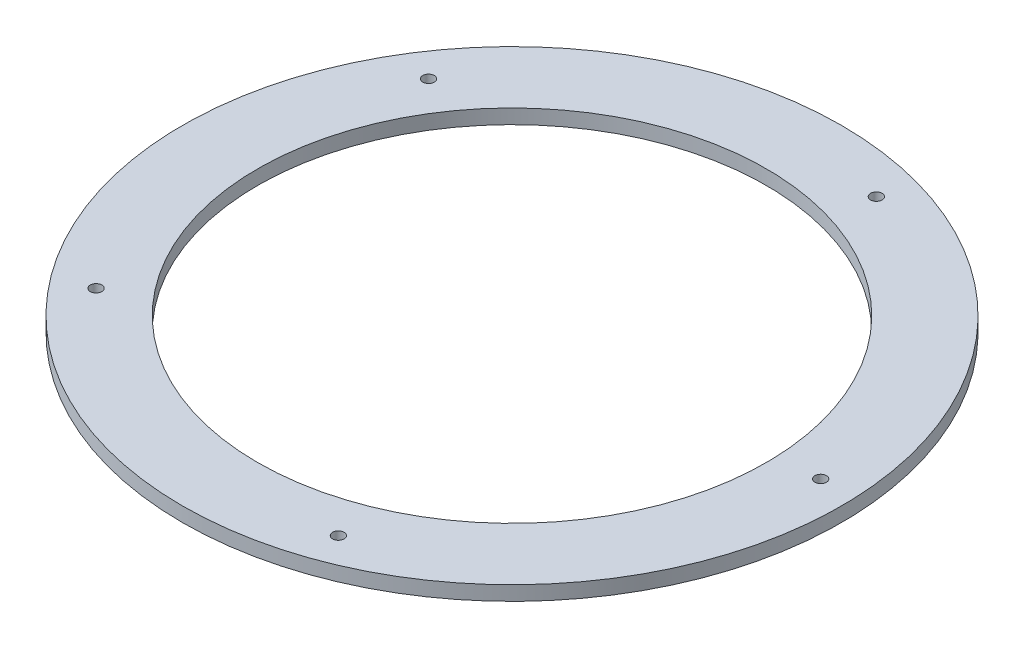
ISO-10303-21;
HEADER;
FILE_DESCRIPTION(('STEP AP214'),'2;1');
FILE_NAME('part.step','',(''),(''),'','','');
FILE_SCHEMA(('AUTOMOTIVE_DESIGN { 1 0 10303 214 1 1 1 1 }'));
ENDSEC;
DATA;
#1=APPLICATION_CONTEXT('core data for automotive mechanical design processes');
#2=APPLICATION_PROTOCOL_DEFINITION('international standard','automotive_design',2000,#1);
#3=PRODUCT_CONTEXT('',#1,'mechanical');
#4=PRODUCT('Part','Part','',(#3));
#5=PRODUCT_RELATED_PRODUCT_CATEGORY('part','',(#4));
#6=PRODUCT_DEFINITION_FORMATION('','',#4);
#7=PRODUCT_DEFINITION_CONTEXT('part definition',#1,'design');
#8=PRODUCT_DEFINITION('design','',#6,#7);
#9=PRODUCT_DEFINITION_SHAPE('','',#8);
#10=(LENGTH_UNIT() NAMED_UNIT(*) SI_UNIT(.MILLI.,.METRE.));
#11=(NAMED_UNIT(*) PLANE_ANGLE_UNIT() SI_UNIT($,.RADIAN.));
#12=(NAMED_UNIT(*) SI_UNIT($,.STERADIAN.) SOLID_ANGLE_UNIT());
#13=UNCERTAINTY_MEASURE_WITH_UNIT(LENGTH_MEASURE(1.E-05),#10,'distance_accuracy_value','');
#14=(GEOMETRIC_REPRESENTATION_CONTEXT(3) GLOBAL_UNCERTAINTY_ASSIGNED_CONTEXT((#13)) GLOBAL_UNIT_ASSIGNED_CONTEXT((#10,
#11,#12)) REPRESENTATION_CONTEXT('',''));
#15=CARTESIAN_POINT('',(0.,0.,0.));
#16=DIRECTION('',(0.,0.,1.));
#17=DIRECTION('',(1.,0.,0.));
#18=AXIS2_PLACEMENT_3D('',#15,#16,#17);
#19=CARTESIAN_POINT('',(0.,3.175,0.));
#20=DIRECTION('',(0.,1.,0.));
#21=DIRECTION('',(0.,0.,1.));
#22=AXIS2_PLACEMENT_3D('',#19,#20,#21);
#23=PLANE('',#22);
#24=CARTESIAN_POINT('',(-54.2225916940951,3.175,-35.8891505329319));
#25=DIRECTION('',(0.,1.,0.));
#26=DIRECTION('',(0.95105651629515,0.,0.309016994374958));
#27=AXIS2_PLACEMENT_3D('',#24,#25,#26);
#28=CIRCLE('',#27,1.27);
#29=CARTESIAN_POINT('',(-53.0147499184003,3.175,-35.4966989500757));
#30=VERTEX_POINT('',#29);
#31=EDGE_CURVE('E72',#30,#30,#28,.T.);
#32=ORIENTED_EDGE('',*,*,#31,.F.);
#33=EDGE_LOOP('',(#32));
#34=FACE_BOUND('',#33,.T.);
#35=CARTESIAN_POINT('',(-50.8883127911717,3.175,40.4783917327241));
#36=DIRECTION('',(0.,1.,0.));
#37=DIRECTION('',(0.58778525229248,0.,-0.809016994374942));
#38=AXIS2_PLACEMENT_3D('',#35,#36,#37);
#39=CIRCLE('',#38,1.27);
#40=CARTESIAN_POINT('',(-50.1418255207603,3.175,39.4509401498679));
#41=VERTEX_POINT('',#40);
#42=EDGE_CURVE('E66',#41,#41,#39,.T.);
#43=ORIENTED_EDGE('',*,*,#42,.F.);
#44=EDGE_LOOP('',(#43));
#45=FACE_BOUND('',#44,.T.);
#46=CARTESIAN_POINT('',(22.7718847590152,3.175,60.906172433688));
#47=DIRECTION('',(0.,1.,0.));
#48=DIRECTION('',(-0.587785252292469,0.,-0.809016994374951));
#49=AXIS2_PLACEMENT_3D('',#46,#47,#48);
#50=CIRCLE('',#49,1.27);
#51=CARTESIAN_POINT('',(22.0253974886038,3.175,59.8787208508318));
#52=VERTEX_POINT('',#51);
#53=EDGE_CURVE('E60',#52,#52,#50,.T.);
#54=ORIENTED_EDGE('',*,*,#53,.F.);
#55=EDGE_LOOP('',(#54));
#56=FACE_BOUND('',#55,.T.);
#57=CARTESIAN_POINT('',(64.9621115601387,3.175,-2.83630704404338));
#58=DIRECTION('',(0.,1.,0.));
#59=DIRECTION('',(-0.951056516295155,0.,0.309016994374945));
#60=AXIS2_PLACEMENT_3D('',#57,#58,#59);
#61=CIRCLE('',#60,1.27);
#62=CARTESIAN_POINT('',(63.7542697844439,3.175,-2.4438554611872));
#63=VERTEX_POINT('',#62);
#64=EDGE_CURVE('E52',#63,#63,#61,.T.);
#65=ORIENTED_EDGE('',*,*,#64,.F.);
#66=EDGE_LOOP('',(#65));
#67=FACE_BOUND('',#66,.T.);
#68=CARTESIAN_POINT('',(17.3769081661126,3.175,-62.6591065894375));
#69=DIRECTION('',(0.,1.,0.));
#70=DIRECTION('',(0.,0.,1.));
#71=AXIS2_PLACEMENT_3D('',#68,#69,#70);
#72=CIRCLE('',#71,1.27);
#73=CARTESIAN_POINT('',(17.3769081661126,3.175,-61.3891065894375));
#74=VERTEX_POINT('',#73);
#75=EDGE_CURVE('E49',#74,#74,#72,.T.);
#76=ORIENTED_EDGE('',*,*,#75,.F.);
#77=EDGE_LOOP('',(#76));
#78=FACE_BOUND('',#77,.T.);
#79=CARTESIAN_POINT('',(0.,3.175,0.));
#80=DIRECTION('',(0.,1.,0.));
#81=DIRECTION('',(0.,0.,1.));
#82=AXIS2_PLACEMENT_3D('',#79,#80,#81);
#83=CIRCLE('',#82,72.39);
#84=CARTESIAN_POINT('',(0.,3.175,72.39));
#85=VERTEX_POINT('',#84);
#86=EDGE_CURVE('E10',#85,#85,#83,.T.);
#87=ORIENTED_EDGE('',*,*,#86,.T.);
#88=EDGE_LOOP('',(#87));
#89=FACE_BOUND('',#88,.T.);
#90=CARTESIAN_POINT('',(0.,3.175,0.));
#91=DIRECTION('',(0.,1.,0.));
#92=DIRECTION('',(0.,0.,1.));
#93=AXIS2_PLACEMENT_3D('',#90,#91,#92);
#94=CIRCLE('',#93,55.88);
#95=CARTESIAN_POINT('',(0.,3.175,55.88));
#96=VERTEX_POINT('',#95);
#97=EDGE_CURVE('E41',#96,#96,#94,.T.);
#98=ORIENTED_EDGE('',*,*,#97,.F.);
#99=EDGE_LOOP('',(#98));
#100=FACE_BOUND('',#99,.T.);
#101=ADVANCED_FACE('F30',(#34,#45,#56,#67,#78,#89,#100),#23,.T.);
#102=CARTESIAN_POINT('',(0.,0.,0.));
#103=DIRECTION('',(0.,1.,0.));
#104=DIRECTION('',(0.,0.,1.));
#105=AXIS2_PLACEMENT_3D('',#102,#103,#104);
#106=PLANE('',#105);
#107=CARTESIAN_POINT('',(-54.2225916940951,0.,-35.8891505329319));
#108=DIRECTION('',(0.,1.,0.));
#109=DIRECTION('',(0.95105651629515,0.,0.309016994374958));
#110=AXIS2_PLACEMENT_3D('',#107,#108,#109);
#111=CIRCLE('',#110,1.27);
#112=CARTESIAN_POINT('',(-53.0147499184003,0.,-35.4966989500757));
#113=VERTEX_POINT('',#112);
#114=EDGE_CURVE('E75',#113,#113,#111,.T.);
#115=ORIENTED_EDGE('',*,*,#114,.T.);
#116=EDGE_LOOP('',(#115));
#117=FACE_BOUND('',#116,.T.);
#118=CARTESIAN_POINT('',(-50.8883127911717,0.,40.4783917327241));
#119=DIRECTION('',(0.,1.,0.));
#120=DIRECTION('',(0.58778525229248,0.,-0.809016994374942));
#121=AXIS2_PLACEMENT_3D('',#118,#119,#120);
#122=CIRCLE('',#121,1.27);
#123=CARTESIAN_POINT('',(-50.1418255207603,0.,39.4509401498679));
#124=VERTEX_POINT('',#123);
#125=EDGE_CURVE('E69',#124,#124,#122,.T.);
#126=ORIENTED_EDGE('',*,*,#125,.T.);
#127=EDGE_LOOP('',(#126));
#128=FACE_BOUND('',#127,.T.);
#129=CARTESIAN_POINT('',(22.7718847590152,0.,60.906172433688));
#130=DIRECTION('',(0.,1.,0.));
#131=DIRECTION('',(-0.587785252292469,0.,-0.809016994374951));
#132=AXIS2_PLACEMENT_3D('',#129,#130,#131);
#133=CIRCLE('',#132,1.27);
#134=CARTESIAN_POINT('',(22.0253974886038,0.,59.8787208508318));
#135=VERTEX_POINT('',#134);
#136=EDGE_CURVE('E63',#135,#135,#133,.T.);
#137=ORIENTED_EDGE('',*,*,#136,.T.);
#138=EDGE_LOOP('',(#137));
#139=FACE_BOUND('',#138,.T.);
#140=CARTESIAN_POINT('',(64.9621115601387,0.,-2.83630704404338));
#141=DIRECTION('',(0.,1.,0.));
#142=DIRECTION('',(-0.951056516295155,0.,0.309016994374945));
#143=AXIS2_PLACEMENT_3D('',#140,#141,#142);
#144=CIRCLE('',#143,1.27);
#145=CARTESIAN_POINT('',(63.7542697844439,0.,-2.4438554611872));
#146=VERTEX_POINT('',#145);
#147=EDGE_CURVE('E57',#146,#146,#144,.T.);
#148=ORIENTED_EDGE('',*,*,#147,.T.);
#149=EDGE_LOOP('',(#148));
#150=FACE_BOUND('',#149,.T.);
#151=CARTESIAN_POINT('',(17.3769081661126,0.,-62.6591065894375));
#152=DIRECTION('',(0.,1.,0.));
#153=DIRECTION('',(0.,0.,1.));
#154=AXIS2_PLACEMENT_3D('',#151,#152,#153);
#155=CIRCLE('',#154,1.27);
#156=CARTESIAN_POINT('',(17.3769081661126,0.,-61.3891065894375));
#157=VERTEX_POINT('',#156);
#158=EDGE_CURVE('E46',#157,#157,#155,.T.);
#159=ORIENTED_EDGE('',*,*,#158,.T.);
#160=EDGE_LOOP('',(#159));
#161=FACE_BOUND('',#160,.T.);
#162=CARTESIAN_POINT('',(0.,0.,0.));
#163=DIRECTION('',(0.,1.,0.));
#164=DIRECTION('',(0.,0.,1.));
#165=AXIS2_PLACEMENT_3D('',#162,#163,#164);
#166=CIRCLE('',#165,72.39);
#167=CARTESIAN_POINT('',(0.,0.,72.39));
#168=VERTEX_POINT('',#167);
#169=EDGE_CURVE('E34',#168,#168,#166,.T.);
#170=ORIENTED_EDGE('',*,*,#169,.F.);
#171=EDGE_LOOP('',(#170));
#172=FACE_BOUND('',#171,.T.);
#173=CARTESIAN_POINT('',(0.,0.,0.));
#174=DIRECTION('',(0.,1.,0.));
#175=DIRECTION('',(0.,0.,1.));
#176=AXIS2_PLACEMENT_3D('',#173,#174,#175);
#177=CIRCLE('',#176,55.88);
#178=CARTESIAN_POINT('',(0.,0.,55.88));
#179=VERTEX_POINT('',#178);
#180=EDGE_CURVE('E43',#179,#179,#177,.T.);
#181=ORIENTED_EDGE('',*,*,#180,.T.);
#182=EDGE_LOOP('',(#181));
#183=FACE_BOUND('',#182,.T.);
#184=ADVANCED_FACE('F79',(#117,#128,#139,#150,#161,#172,#183),#106,.F.);
#185=CARTESIAN_POINT('',(0.,3.175,0.));
#186=DIRECTION('',(0.,-1.,0.));
#187=DIRECTION('',(0.,0.,-1.));
#188=AXIS2_PLACEMENT_3D('',#185,#186,#187);
#189=CYLINDRICAL_SURFACE('',#188,72.39);
#190=ORIENTED_EDGE('',*,*,#86,.F.);
#191=EDGE_LOOP('',(#190));
#192=FACE_BOUND('',#191,.T.);
#193=ORIENTED_EDGE('',*,*,#169,.T.);
#194=EDGE_LOOP('',(#193));
#195=FACE_BOUND('',#194,.T.);
#196=ADVANCED_FACE('F32',(#192,#195),#189,.T.);
#197=CARTESIAN_POINT('',(0.,3.175,0.));
#198=DIRECTION('',(0.,-1.,0.));
#199=DIRECTION('',(0.,0.,-1.));
#200=AXIS2_PLACEMENT_3D('',#197,#198,#199);
#201=CYLINDRICAL_SURFACE('',#200,55.88);
#202=ORIENTED_EDGE('',*,*,#97,.T.);
#203=EDGE_LOOP('',(#202));
#204=FACE_BOUND('',#203,.T.);
#205=ORIENTED_EDGE('',*,*,#180,.F.);
#206=EDGE_LOOP('',(#205));
#207=FACE_BOUND('',#206,.T.);
#208=ADVANCED_FACE('F102',(#204,#207),#201,.F.);
#209=CARTESIAN_POINT('',(17.3769081661126,0.,-62.6591065894375));
#210=DIRECTION('',(0.,1.,0.));
#211=DIRECTION('',(0.,0.,1.));
#212=AXIS2_PLACEMENT_3D('',#209,#210,#211);
#213=CYLINDRICAL_SURFACE('',#212,1.27);
#214=ORIENTED_EDGE('',*,*,#158,.F.);
#215=EDGE_LOOP('',(#214));
#216=FACE_BOUND('',#215,.T.);
#217=ORIENTED_EDGE('',*,*,#75,.T.);
#218=EDGE_LOOP('',(#217));
#219=FACE_BOUND('',#218,.T.);
#220=ADVANCED_FACE('F105',(#216,#219),#213,.F.);
#221=CARTESIAN_POINT('',(64.9621115601387,0.,-2.83630704404338));
#222=DIRECTION('',(0.,1.,0.));
#223=DIRECTION('',(-0.951056516295155,0.,0.309016994374945));
#224=AXIS2_PLACEMENT_3D('',#221,#222,#223);
#225=CYLINDRICAL_SURFACE('',#224,1.27);
#226=ORIENTED_EDGE('',*,*,#147,.F.);
#227=EDGE_LOOP('',(#226));
#228=FACE_BOUND('',#227,.T.);
#229=ORIENTED_EDGE('',*,*,#64,.T.);
#230=EDGE_LOOP('',(#229));
#231=FACE_BOUND('',#230,.T.);
#232=ADVANCED_FACE('F117',(#228,#231),#225,.F.);
#233=CARTESIAN_POINT('',(22.7718847590152,0.,60.906172433688));
#234=DIRECTION('',(0.,1.,0.));
#235=DIRECTION('',(-0.587785252292469,0.,-0.809016994374951));
#236=AXIS2_PLACEMENT_3D('',#233,#234,#235);
#237=CYLINDRICAL_SURFACE('',#236,1.27);
#238=ORIENTED_EDGE('',*,*,#136,.F.);
#239=EDGE_LOOP('',(#238));
#240=FACE_BOUND('',#239,.T.);
#241=ORIENTED_EDGE('',*,*,#53,.T.);
#242=EDGE_LOOP('',(#241));
#243=FACE_BOUND('',#242,.T.);
#244=ADVANCED_FACE('F121',(#240,#243),#237,.F.);
#245=CARTESIAN_POINT('',(-50.8883127911717,0.,40.4783917327241));
#246=DIRECTION('',(0.,1.,0.));
#247=DIRECTION('',(0.58778525229248,0.,-0.809016994374942));
#248=AXIS2_PLACEMENT_3D('',#245,#246,#247);
#249=CYLINDRICAL_SURFACE('',#248,1.27);
#250=ORIENTED_EDGE('',*,*,#125,.F.);
#251=EDGE_LOOP('',(#250));
#252=FACE_BOUND('',#251,.T.);
#253=ORIENTED_EDGE('',*,*,#42,.T.);
#254=EDGE_LOOP('',(#253));
#255=FACE_BOUND('',#254,.T.);
#256=ADVANCED_FACE('F85',(#252,#255),#249,.F.);
#257=CARTESIAN_POINT('',(-54.2225916940951,0.,-35.8891505329319));
#258=DIRECTION('',(0.,1.,0.));
#259=DIRECTION('',(0.95105651629515,0.,0.309016994374958));
#260=AXIS2_PLACEMENT_3D('',#257,#258,#259);
#261=CYLINDRICAL_SURFACE('',#260,1.27);
#262=ORIENTED_EDGE('',*,*,#114,.F.);
#263=EDGE_LOOP('',(#262));
#264=FACE_BOUND('',#263,.T.);
#265=ORIENTED_EDGE('',*,*,#31,.T.);
#266=EDGE_LOOP('',(#265));
#267=FACE_BOUND('',#266,.T.);
#268=ADVANCED_FACE('F82',(#264,#267),#261,.F.);
#269=CLOSED_SHELL('',(#101,#184,#196,#208,#220,#232,#244,#256,#268));
#270=MANIFOLD_SOLID_BREP('B2',#269);
#271=ADVANCED_BREP_SHAPE_REPRESENTATION('',(#18,#270),#14);
#272=SHAPE_DEFINITION_REPRESENTATION(#9,#271);
ENDSEC;
END-ISO-10303-21;
